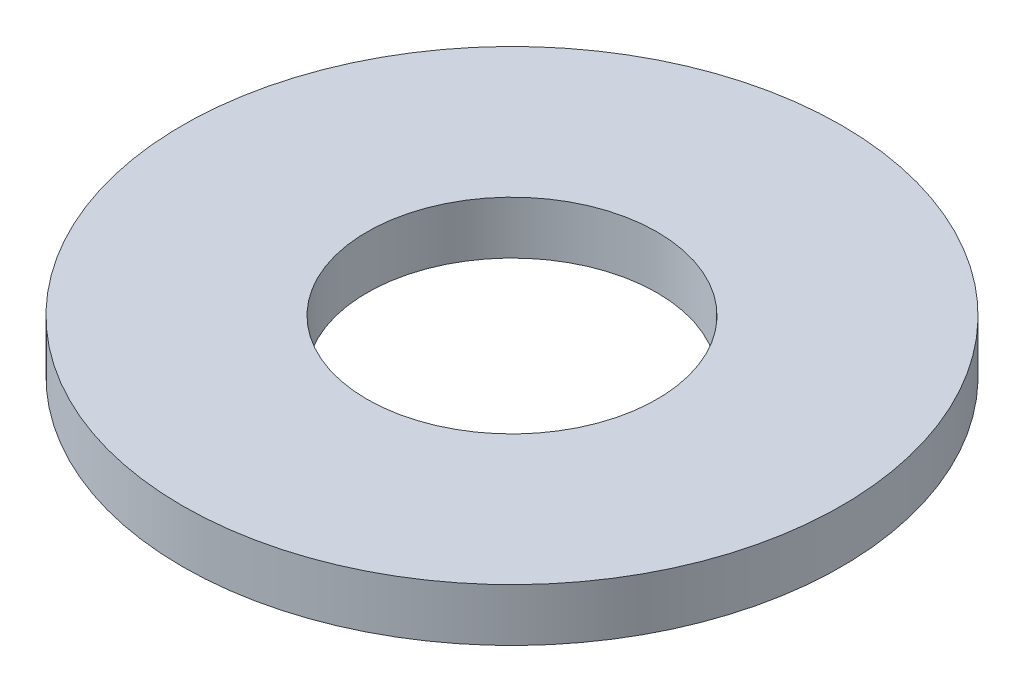
ISO-10303-21;
HEADER;
FILE_DESCRIPTION(('STEP AP214'),'2;1');
FILE_NAME('part.step','',(''),(''),'','','');
FILE_SCHEMA(('AUTOMOTIVE_DESIGN { 1 0 10303 214 1 1 1 1 }'));
ENDSEC;
DATA;
#1=APPLICATION_CONTEXT('core data for automotive mechanical design processes');
#2=APPLICATION_PROTOCOL_DEFINITION('international standard','automotive_design',2000,#1);
#3=PRODUCT_CONTEXT('',#1,'mechanical');
#4=PRODUCT('Part','Part','',(#3));
#5=PRODUCT_RELATED_PRODUCT_CATEGORY('part','',(#4));
#6=PRODUCT_DEFINITION_FORMATION('','',#4);
#7=PRODUCT_DEFINITION_CONTEXT('part definition',#1,'design');
#8=PRODUCT_DEFINITION('design','',#6,#7);
#9=PRODUCT_DEFINITION_SHAPE('','',#8);
#10=(LENGTH_UNIT() NAMED_UNIT(*) SI_UNIT(.MILLI.,.METRE.));
#11=(NAMED_UNIT(*) PLANE_ANGLE_UNIT() SI_UNIT($,.RADIAN.));
#12=(NAMED_UNIT(*) SI_UNIT($,.STERADIAN.) SOLID_ANGLE_UNIT());
#13=UNCERTAINTY_MEASURE_WITH_UNIT(LENGTH_MEASURE(1.E-05),#10,'distance_accuracy_value','');
#14=(GEOMETRIC_REPRESENTATION_CONTEXT(3) GLOBAL_UNCERTAINTY_ASSIGNED_CONTEXT((#13)) GLOBAL_UNIT_ASSIGNED_CONTEXT((#10,
#11,#12)) REPRESENTATION_CONTEXT('',''));
#15=CARTESIAN_POINT('',(0.,0.,0.));
#16=DIRECTION('',(0.,0.,1.));
#17=DIRECTION('',(1.,0.,0.));
#18=AXIS2_PLACEMENT_3D('',#15,#16,#17);
#19=CARTESIAN_POINT('',(-13.4902949203716,0.4,-17.5468171691547));
#20=DIRECTION('',(0.,1.,0.));
#21=DIRECTION('',(0.,0.,1.));
#22=AXIS2_PLACEMENT_3D('',#19,#20,#21);
#23=PLANE('',#22);
#24=CARTESIAN_POINT('',(-13.4902949203716,0.4,-17.5468171691547));
#25=DIRECTION('',(0.,1.,0.));
#26=DIRECTION('',(0.,0.,1.));
#27=AXIS2_PLACEMENT_3D('',#24,#25,#26);
#28=CIRCLE('',#27,2.5);
#29=CARTESIAN_POINT('',(-13.4902949203716,0.4,-15.0468171691547));
#30=VERTEX_POINT('',#29);
#31=EDGE_CURVE('E12',#30,#30,#28,.T.);
#32=ORIENTED_EDGE('',*,*,#31,.T.);
#33=EDGE_LOOP('',(#32));
#34=FACE_BOUND('',#33,.T.);
#35=CARTESIAN_POINT('',(-13.4902949203716,0.4,-17.5468171691547));
#36=DIRECTION('',(0.,1.,0.));
#37=DIRECTION('',(0.,0.,1.));
#38=AXIS2_PLACEMENT_3D('',#35,#36,#37);
#39=CIRCLE('',#38,1.1);
#40=CARTESIAN_POINT('',(-13.4902949203716,0.4,-16.4468171691547));
#41=VERTEX_POINT('',#40);
#42=EDGE_CURVE('E52',#41,#41,#39,.T.);
#43=ORIENTED_EDGE('',*,*,#42,.F.);
#44=EDGE_LOOP('',(#43));
#45=FACE_BOUND('',#44,.T.);
#46=ADVANCED_FACE('F41',(#34,#45),#23,.T.);
#47=CARTESIAN_POINT('',(-13.4902949203716,0.,-17.5468171691547));
#48=DIRECTION('',(0.,1.,0.));
#49=DIRECTION('',(0.,0.,1.));
#50=AXIS2_PLACEMENT_3D('',#47,#48,#49);
#51=PLANE('',#50);
#52=CARTESIAN_POINT('',(-13.4902949203716,0.,-17.5468171691547));
#53=DIRECTION('',(0.,1.,0.));
#54=DIRECTION('',(0.,0.,1.));
#55=AXIS2_PLACEMENT_3D('',#52,#53,#54);
#56=CIRCLE('',#55,2.5);
#57=CARTESIAN_POINT('',(-13.4902949203716,0.,-15.0468171691547));
#58=VERTEX_POINT('',#57);
#59=EDGE_CURVE('E45',#58,#58,#56,.T.);
#60=ORIENTED_EDGE('',*,*,#59,.F.);
#61=EDGE_LOOP('',(#60));
#62=FACE_BOUND('',#61,.T.);
#63=CARTESIAN_POINT('',(-13.4902949203716,0.,-17.5468171691547));
#64=DIRECTION('',(0.,1.,0.));
#65=DIRECTION('',(0.,0.,1.));
#66=AXIS2_PLACEMENT_3D('',#63,#64,#65);
#67=CIRCLE('',#66,1.1);
#68=CARTESIAN_POINT('',(-13.4902949203716,0.,-16.4468171691547));
#69=VERTEX_POINT('',#68);
#70=EDGE_CURVE('E54',#69,#69,#67,.T.);
#71=ORIENTED_EDGE('',*,*,#70,.T.);
#72=EDGE_LOOP('',(#71));
#73=FACE_BOUND('',#72,.T.);
#74=ADVANCED_FACE('F64',(#62,#73),#51,.F.);
#75=CARTESIAN_POINT('',(-13.4902949203716,0.4,-17.5468171691547));
#76=DIRECTION('',(0.,-1.,0.));
#77=DIRECTION('',(0.,0.,-1.));
#78=AXIS2_PLACEMENT_3D('',#75,#76,#77);
#79=CYLINDRICAL_SURFACE('',#78,2.5);
#80=ORIENTED_EDGE('',*,*,#31,.F.);
#81=EDGE_LOOP('',(#80));
#82=FACE_BOUND('',#81,.T.);
#83=ORIENTED_EDGE('',*,*,#59,.T.);
#84=EDGE_LOOP('',(#83));
#85=FACE_BOUND('',#84,.T.);
#86=ADVANCED_FACE('F43',(#82,#85),#79,.T.);
#87=CARTESIAN_POINT('',(-13.4902949203716,0.4,-17.5468171691547));
#88=DIRECTION('',(0.,-1.,0.));
#89=DIRECTION('',(0.,0.,-1.));
#90=AXIS2_PLACEMENT_3D('',#87,#88,#89);
#91=CYLINDRICAL_SURFACE('',#90,1.1);
#92=ORIENTED_EDGE('',*,*,#42,.T.);
#93=EDGE_LOOP('',(#92));
#94=FACE_BOUND('',#93,.T.);
#95=ORIENTED_EDGE('',*,*,#70,.F.);
#96=EDGE_LOOP('',(#95));
#97=FACE_BOUND('',#96,.T.);
#98=ADVANCED_FACE('F60',(#94,#97),#91,.F.);
#99=CLOSED_SHELL('',(#46,#74,#86,#98));
#100=MANIFOLD_SOLID_BREP('B2',#99);
#101=ADVANCED_BREP_SHAPE_REPRESENTATION('',(#18,#100),#14);
#102=SHAPE_DEFINITION_REPRESENTATION(#9,#101);
ENDSEC;
END-ISO-10303-21;
